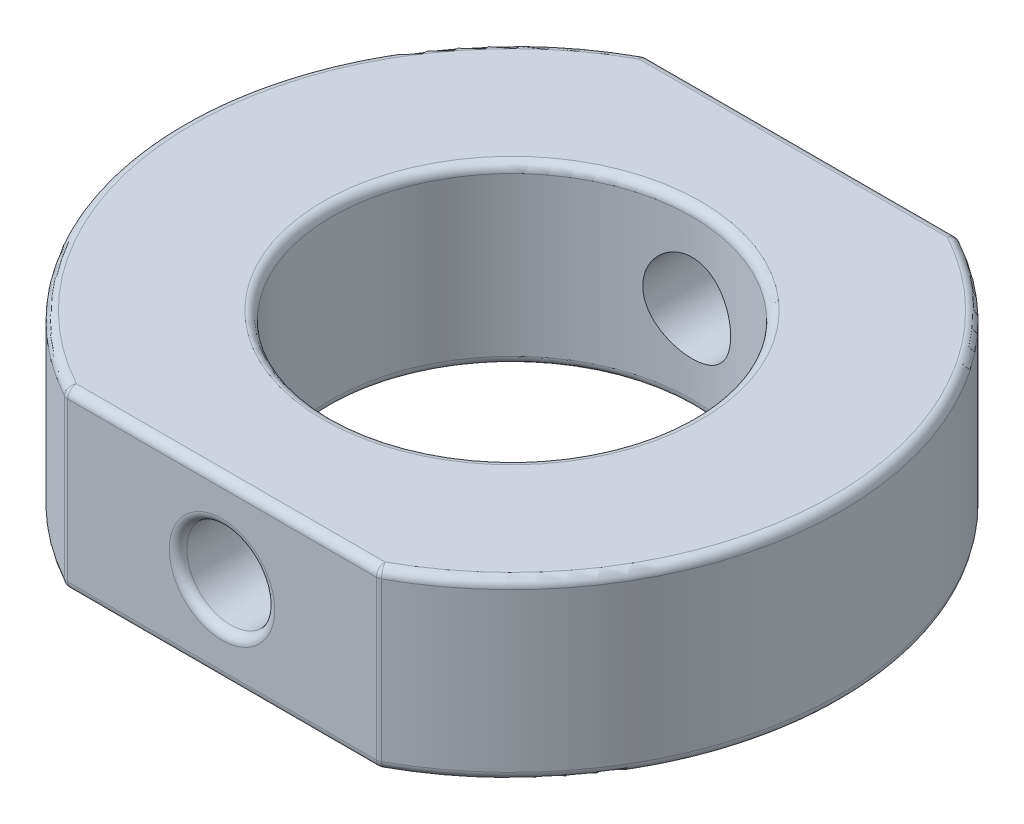
ISO-10303-21;
HEADER;
FILE_DESCRIPTION(('STEP AP214'),'2;1');
FILE_NAME('part.step','',(''),(''),'','','');
FILE_SCHEMA(('AUTOMOTIVE_DESIGN { 1 0 10303 214 1 1 1 1 }'));
ENDSEC;
DATA;
#1=APPLICATION_CONTEXT('core data for automotive mechanical design processes');
#2=APPLICATION_PROTOCOL_DEFINITION('international standard','automotive_design',2000,#1);
#3=PRODUCT_CONTEXT('',#1,'mechanical');
#4=PRODUCT('Part','Part','',(#3));
#5=PRODUCT_RELATED_PRODUCT_CATEGORY('part','',(#4));
#6=PRODUCT_DEFINITION_FORMATION('','',#4);
#7=PRODUCT_DEFINITION_CONTEXT('part definition',#1,'design');
#8=PRODUCT_DEFINITION('design','',#6,#7);
#9=PRODUCT_DEFINITION_SHAPE('','',#8);
#10=(LENGTH_UNIT() NAMED_UNIT(*) SI_UNIT(.MILLI.,.METRE.));
#11=(NAMED_UNIT(*) PLANE_ANGLE_UNIT() SI_UNIT($,.RADIAN.));
#12=(NAMED_UNIT(*) SI_UNIT($,.STERADIAN.) SOLID_ANGLE_UNIT());
#13=UNCERTAINTY_MEASURE_WITH_UNIT(LENGTH_MEASURE(1.E-05),#10,'distance_accuracy_value','');
#14=(GEOMETRIC_REPRESENTATION_CONTEXT(3) GLOBAL_UNCERTAINTY_ASSIGNED_CONTEXT((#13)) GLOBAL_UNIT_ASSIGNED_CONTEXT((#10,
#11,#12)) REPRESENTATION_CONTEXT('',''));
#15=CARTESIAN_POINT('',(0.,0.,0.));
#16=DIRECTION('',(0.,0.,1.));
#17=DIRECTION('',(1.,0.,0.));
#18=AXIS2_PLACEMENT_3D('',#15,#16,#17);
#19=CARTESIAN_POINT('',(0.,-2.,0.));
#20=DIRECTION('',(0.,1.,0.));
#21=DIRECTION('',(0.,0.,1.));
#22=AXIS2_PLACEMENT_3D('',#19,#20,#21);
#23=CYLINDRICAL_SURFACE('',#22,7.5);
#24=DIRECTION('',(0.,1.,0.));
#25=VECTOR('',#24,1.);
#26=CARTESIAN_POINT('',(3.6076129861807,-2.,-6.57534246575343));
#27=LINE('',#26,#25);
#28=CARTESIAN_POINT('',(3.6076129861807,-1.8,-6.57534246575343));
#29=VERTEX_POINT('',#28);
#30=CARTESIAN_POINT('',(3.6076129861807,1.8,-6.57534246575343));
#31=VERTEX_POINT('',#30);
#32=EDGE_CURVE('E189',#29,#31,#27,.T.);
#33=ORIENTED_EDGE('',*,*,#32,.T.);
#34=CARTESIAN_POINT('',(0.,1.8,0.));
#35=DIRECTION('',(0.,1.,0.));
#36=DIRECTION('',(0.,0.,1.));
#37=AXIS2_PLACEMENT_3D('',#34,#35,#36);
#38=CIRCLE('',#37,7.5);
#39=CARTESIAN_POINT('',(3.6076129861807,1.8,6.57534246575343));
#40=VERTEX_POINT('',#39);
#41=EDGE_CURVE('E196',#31,#40,#38,.F.);
#42=ORIENTED_EDGE('',*,*,#41,.T.);
#43=DIRECTION('',(0.,1.,0.));
#44=VECTOR('',#43,1.);
#45=CARTESIAN_POINT('',(3.6076129861807,-2.,6.57534246575343));
#46=LINE('',#45,#44);
#47=CARTESIAN_POINT('',(3.6076129861807,-1.8,6.57534246575343));
#48=VERTEX_POINT('',#47);
#49=EDGE_CURVE('E192',#40,#48,#46,.F.);
#50=ORIENTED_EDGE('',*,*,#49,.T.);
#51=CARTESIAN_POINT('',(0.,-1.8,0.));
#52=DIRECTION('',(0.,1.,0.));
#53=DIRECTION('',(0.,0.,1.));
#54=AXIS2_PLACEMENT_3D('',#51,#52,#53);
#55=CIRCLE('',#54,7.5);
#56=EDGE_CURVE('E186',#48,#29,#55,.T.);
#57=ORIENTED_EDGE('',*,*,#56,.T.);
#58=EDGE_LOOP('',(#33,#42,#50,#57));
#59=FACE_BOUND('',#58,.T.);
#60=ADVANCED_FACE('F39',(#59),#23,.T.);
#61=DIRECTION('',(0.,1.,0.));
#62=VECTOR('',#61,1.);
#63=CARTESIAN_POINT('',(-3.60761298618069,-2.,6.57534246575343));
#64=LINE('',#63,#62);
#65=CARTESIAN_POINT('',(-3.60761298618069,-1.8,6.57534246575343));
#66=VERTEX_POINT('',#65);
#67=CARTESIAN_POINT('',(-3.60761298618069,1.8,6.57534246575343));
#68=VERTEX_POINT('',#67);
#69=EDGE_CURVE('E149',#66,#68,#64,.T.);
#70=ORIENTED_EDGE('',*,*,#69,.T.);
#71=CARTESIAN_POINT('',(0.,1.8,0.));
#72=DIRECTION('',(0.,1.,0.));
#73=DIRECTION('',(0.,0.,1.));
#74=AXIS2_PLACEMENT_3D('',#71,#72,#73);
#75=CIRCLE('',#74,7.5);
#76=CARTESIAN_POINT('',(-3.6076129861807,1.8,-6.57534246575343));
#77=VERTEX_POINT('',#76);
#78=EDGE_CURVE('E207',#68,#77,#75,.F.);
#79=ORIENTED_EDGE('',*,*,#78,.T.);
#80=DIRECTION('',(0.,1.,0.));
#81=VECTOR('',#80,1.);
#82=CARTESIAN_POINT('',(-3.6076129861807,-2.,-6.57534246575343));
#83=LINE('',#82,#81);
#84=CARTESIAN_POINT('',(-3.6076129861807,-1.8,-6.57534246575343));
#85=VERTEX_POINT('',#84);
#86=EDGE_CURVE('E202',#77,#85,#83,.F.);
#87=ORIENTED_EDGE('',*,*,#86,.T.);
#88=CARTESIAN_POINT('',(0.,-1.8,0.));
#89=DIRECTION('',(0.,1.,0.));
#90=DIRECTION('',(0.,0.,1.));
#91=AXIS2_PLACEMENT_3D('',#88,#89,#90);
#92=CIRCLE('',#91,7.5);
#93=EDGE_CURVE('E199',#85,#66,#92,.T.);
#94=ORIENTED_EDGE('',*,*,#93,.T.);
#95=EDGE_LOOP('',(#70,#79,#87,#94));
#96=FACE_BOUND('',#95,.T.);
#97=ADVANCED_FACE('F387',(#96),#23,.T.);
#98=CARTESIAN_POINT('',(0.,-2.,0.));
#99=DIRECTION('',(0.,1.,0.));
#100=DIRECTION('',(0.,0.,1.));
#101=AXIS2_PLACEMENT_3D('',#98,#99,#100);
#102=PLANE('',#101);
#103=CARTESIAN_POINT('',(0.,-2.,0.));
#104=DIRECTION('',(0.,1.,0.));
#105=DIRECTION('',(0.,0.,1.));
#106=AXIS2_PLACEMENT_3D('',#103,#104,#105);
#107=CIRCLE('',#106,7.3);
#108=CARTESIAN_POINT('',(3.51140997321588,-2.,-6.4));
#109=VERTEX_POINT('',#108);
#110=CARTESIAN_POINT('',(3.51140997321588,-2.,6.40000000000001));
#111=VERTEX_POINT('',#110);
#112=EDGE_CURVE('E49',#109,#111,#107,.F.);
#113=ORIENTED_EDGE('',*,*,#112,.T.);
#114=DIRECTION('',(-1.,0.,0.));
#115=VECTOR('',#114,1.);
#116=CARTESIAN_POINT('',(0.,-2.,6.40000000000001));
#117=LINE('',#116,#115);
#118=CARTESIAN_POINT('',(-3.51140997321588,-2.,6.40000000000001));
#119=VERTEX_POINT('',#118);
#120=EDGE_CURVE('E11',#111,#119,#117,.T.);
#121=ORIENTED_EDGE('',*,*,#120,.T.);
#122=CARTESIAN_POINT('',(0.,-2.,0.));
#123=DIRECTION('',(0.,1.,0.));
#124=DIRECTION('',(0.,0.,1.));
#125=AXIS2_PLACEMENT_3D('',#122,#123,#124);
#126=CIRCLE('',#125,7.3);
#127=CARTESIAN_POINT('',(-3.51140997321589,-2.,-6.4));
#128=VERTEX_POINT('',#127);
#129=EDGE_CURVE('E260',#119,#128,#126,.F.);
#130=ORIENTED_EDGE('',*,*,#129,.T.);
#131=DIRECTION('',(1.,0.,0.));
#132=VECTOR('',#131,1.);
#133=CARTESIAN_POINT('',(0.,-2.,-6.4));
#134=LINE('',#133,#132);
#135=EDGE_CURVE('E60',#128,#109,#134,.T.);
#136=ORIENTED_EDGE('',*,*,#135,.T.);
#137=EDGE_LOOP('',(#113,#121,#130,#136));
#138=FACE_BOUND('',#137,.T.);
#139=CARTESIAN_POINT('',(0.,-2.,0.));
#140=DIRECTION('',(0.,1.,0.));
#141=DIRECTION('',(0.,0.,1.));
#142=AXIS2_PLACEMENT_3D('',#139,#140,#141);
#143=CIRCLE('',#142,4.3);
#144=CARTESIAN_POINT('',(0.,-2.,4.3));
#145=VERTEX_POINT('',#144);
#146=EDGE_CURVE('E256',#145,#145,#143,.T.);
#147=ORIENTED_EDGE('',*,*,#146,.T.);
#148=EDGE_LOOP('',(#147));
#149=FACE_BOUND('',#148,.T.);
#150=ADVANCED_FACE('F383',(#138,#149),#102,.F.);
#151=CARTESIAN_POINT('',(0.,-2.,0.));
#152=DIRECTION('',(0.,1.,0.));
#153=DIRECTION('',(0.,0.,1.));
#154=AXIS2_PLACEMENT_3D('',#151,#152,#153);
#155=CYLINDRICAL_SURFACE('',#154,4.1);
#156=CARTESIAN_POINT('',(0.,1.8,0.));
#157=DIRECTION('',(0.,1.,0.));
#158=DIRECTION('',(0.,0.,1.));
#159=AXIS2_PLACEMENT_3D('',#156,#157,#158);
#160=CIRCLE('',#159,4.1);
#161=CARTESIAN_POINT('',(0.,1.8,4.1));
#162=VERTEX_POINT('',#161);
#163=EDGE_CURVE('E235',#162,#162,#160,.T.);
#164=ORIENTED_EDGE('',*,*,#163,.T.);
#165=EDGE_LOOP('',(#164));
#166=FACE_BOUND('',#165,.T.);
#167=CARTESIAN_POINT('',(0.,-1.8,0.));
#168=DIRECTION('',(0.,1.,0.));
#169=DIRECTION('',(0.,0.,1.));
#170=AXIS2_PLACEMENT_3D('',#167,#168,#169);
#171=CIRCLE('',#170,4.1);
#172=CARTESIAN_POINT('',(0.,-1.8,4.1));
#173=VERTEX_POINT('',#172);
#174=EDGE_CURVE('E231',#173,#173,#171,.F.);
#175=ORIENTED_EDGE('',*,*,#174,.T.);
#176=EDGE_LOOP('',(#175));
#177=FACE_BOUND('',#176,.T.);
#178=CARTESIAN_POINT('',(0.,-1.,4.1));
#179=CARTESIAN_POINT('',(0.0552940782059804,-0.999998372036422,4.09999903855374));
#180=CARTESIAN_POINT('',(0.110606625106424,-0.995398405194165,4.09887023541631));
#181=CARTESIAN_POINT('',(0.219649336489441,-0.977145891798735,4.09447651710224));
#182=CARTESIAN_POINT('',(0.27337853637448,-0.963487941389928,4.09121032680828));
#183=CARTESIAN_POINT('',(0.377663887569064,-0.927581535553456,4.08290392259872));
#184=CARTESIAN_POINT('',(0.428223669187377,-0.905343125357365,4.07786578372922));
#185=CARTESIAN_POINT('',(0.524894583583664,-0.852941719679801,4.06655350781751));
#186=CARTESIAN_POINT('',(0.571005619145269,-0.822778551075884,4.06027934377413));
#187=CARTESIAN_POINT('',(0.658377598944572,-0.754756816530616,4.04703942321076));
#188=CARTESIAN_POINT('',(0.699538541166774,-0.716771789270321,4.04006341221194));
#189=CARTESIAN_POINT('',(0.774973181112786,-0.63445549766485,4.02627498773599));
#190=CARTESIAN_POINT('',(0.809246137026267,-0.590123550659623,4.01946259194909));
#191=CARTESIAN_POINT('',(0.870396245048834,-0.495602963098285,4.00666983608114));
#192=CARTESIAN_POINT('',(0.897162640440335,-0.445340743051743,4.00070252069429));
#193=CARTESIAN_POINT('',(0.941827948134004,-0.340861276481323,3.99042466007413));
#194=CARTESIAN_POINT('',(0.959728203354091,-0.286644630346247,3.98611386395683));
#195=CARTESIAN_POINT('',(0.985814126040096,-0.176892029513995,3.97974233878165));
#196=CARTESIAN_POINT('',(0.994179053402999,-0.121401143079764,3.97764015030589));
#197=CARTESIAN_POINT('',(1.00151504689488,-0.00976691073506362,3.9757996761513));
#198=CARTESIAN_POINT('',(1.00048756330193,0.0463763331081408,3.97606102551957));
#199=CARTESIAN_POINT('',(0.989211176077876,0.156356327065886,3.97888077440598));
#200=CARTESIAN_POINT('',(0.979174756911182,0.210216431265045,3.98138624131811));
#201=CARTESIAN_POINT('',(0.950503878980593,0.31546442464363,3.98832770386222));
#202=CARTESIAN_POINT('',(0.931868834068214,0.366852145022605,3.99276383110169));
#203=CARTESIAN_POINT('',(0.886345775444828,0.466272046962422,4.00311608473029));
#204=CARTESIAN_POINT('',(0.85937971496844,0.514266984566723,4.0090461049084));
#205=CARTESIAN_POINT('',(0.798014731838712,0.605127337396589,4.02171000195212));
#206=CARTESIAN_POINT('',(0.763614566500254,0.647991893163753,4.02844401312855));
#207=CARTESIAN_POINT('',(0.687252265162581,0.728593595599813,4.04218089019983));
#208=CARTESIAN_POINT('',(0.645110526335512,0.766160391374175,4.04918609759026));
#209=CARTESIAN_POINT('',(0.555042132200762,0.833725103344055,4.06251123383387));
#210=CARTESIAN_POINT('',(0.507115316594515,0.863722809736633,4.06883114368894));
#211=CARTESIAN_POINT('',(0.40660140379862,0.915356104020702,4.08010263682613));
#212=CARTESIAN_POINT('',(0.354000137064089,0.936965121833657,4.08504985840865));
#213=CARTESIAN_POINT('',(0.245764416646924,0.970987309599903,4.09298673249365));
#214=CARTESIAN_POINT('',(0.190130516410389,0.983402151469438,4.09597674089437));
#215=CARTESIAN_POINT('',(0.0788661990384491,0.998425963174271,4.09961003794025));
#216=CARTESIAN_POINT('',(0.0232688934224516,1.00126705696586,4.1003088666938));
#217=CARTESIAN_POINT('',(-0.0876065244200136,0.997697842506915,4.09943873121107));
#218=CARTESIAN_POINT('',(-0.142884663502494,0.991288324376395,4.09786996065663));
#219=CARTESIAN_POINT('',(-0.250753662696433,0.969591438723519,4.09267638085782));
#220=CARTESIAN_POINT('',(-0.303371321524609,0.954429707430751,4.08908068451773));
#221=CARTESIAN_POINT('',(-0.405314368401503,0.915801452895595,4.08023780565242));
#222=CARTESIAN_POINT('',(-0.45463943294741,0.892334115036999,4.07499046113868));
#223=CARTESIAN_POINT('',(-0.549528168551345,0.837304082762159,4.06329241453009));
#224=CARTESIAN_POINT('',(-0.595013284338723,0.805610071183155,4.05682270468826));
#225=CARTESIAN_POINT('',(-0.680102017696988,0.735195226973056,4.04342920300753));
#226=CARTESIAN_POINT('',(-0.719704669886258,0.696473243280604,4.03650533690443));
#227=CARTESIAN_POINT('',(-0.79285308547962,0.612026148094777,4.02278556894238));
#228=CARTESIAN_POINT('',(-0.826236402696306,0.566159003427226,4.01599639733157));
#229=CARTESIAN_POINT('',(-0.884830746828476,0.46933566573817,4.00349543267167));
#230=CARTESIAN_POINT('',(-0.910042139214909,0.418379700436079,3.99778359144617));
#231=CARTESIAN_POINT('',(-0.951391477981672,0.313101681998428,3.98814558858549));
#232=CARTESIAN_POINT('',(-0.967583115890355,0.258801731686838,3.98420888747609));
#233=CARTESIAN_POINT('',(-0.990578792127384,0.148140454119125,3.97855457467218));
#234=CARTESIAN_POINT('',(-0.997384766355246,0.091779554419802,3.97683650536436));
#235=CARTESIAN_POINT('',(-1.0013184796955,-0.0197540026068407,3.97584765644602));
#236=CARTESIAN_POINT('',(-0.998705390006952,-0.0749170880916083,3.97651133925525));
#237=CARTESIAN_POINT('',(-0.984465490009799,-0.183990734619739,3.98006036411582));
#238=CARTESIAN_POINT('',(-0.972838844248606,-0.237901318509702,3.98294566561028));
#239=CARTESIAN_POINT('',(-0.941040223166038,-0.342673391314973,3.99057720406715));
#240=CARTESIAN_POINT('',(-0.920914638060117,-0.393549746675563,3.99531332826666));
#241=CARTESIAN_POINT('',(-0.872726542508613,-0.491239107022708,4.00611475162218));
#242=CARTESIAN_POINT('',(-0.844662984569503,-0.53805157467314,4.01218022617524));
#243=CARTESIAN_POINT('',(-0.780573458182831,-0.627541979151474,4.02514563534908));
#244=CARTESIAN_POINT('',(-0.744366637789082,-0.670087954165547,4.03206258636593));
#245=CARTESIAN_POINT('',(-0.665373744427921,-0.748584684244539,4.04584754270277));
#246=CARTESIAN_POINT('',(-0.622586122222779,-0.784533881928943,4.05271553609786));
#247=CARTESIAN_POINT('',(-0.530767939394041,-0.849410824998653,4.06576800041917));
#248=CARTESIAN_POINT('',(-0.481643574995764,-0.87820874845831,4.07193885905787));
#249=CARTESIAN_POINT('',(-0.379105999715491,-0.927091829209374,4.0827597978445));
#250=CARTESIAN_POINT('',(-0.32569600689174,-0.94718345278728,4.08741100602347));
#251=CARTESIAN_POINT('',(-0.226956955234012,-0.974976635536325,4.09395131283817));
#252=CARTESIAN_POINT('',(-0.182112573955288,-0.984340621200724,4.09620431244597));
#253=CARTESIAN_POINT('',(-0.091516304294484,-0.996852765884684,4.09922900355809));
#254=CARTESIAN_POINT('',(-0.045764477809185,-1.00000134739389,4.1000007957468));
#255=CARTESIAN_POINT('',(0.,-1.,4.1));
#256=B_SPLINE_CURVE_WITH_KNOTS('',3,(#178,#179,#180,#181,#182,#183,#184,#185,#186,#187,#188,
#189,#190,#191,#192,#193,#194,#195,#196,#197,#198,#199,#200,#201,#202,#203,#204,#205,#206,#207,
#208,#209,#210,#211,#212,#213,#214,#215,#216,#217,#218,#219,#220,#221,#222,#223,#224,#225,#226,
#227,#228,#229,#230,#231,#232,#233,#234,#235,#236,#237,#238,#239,#240,#241,#242,#243,#244,#245,
#246,#247,#248,#249,#250,#251,#252,#253,#254,#255),.UNSPECIFIED.,.T.,.F.,(4,2,2,2,2,2,2,2,2,2,2,
2,2,2,2,2,2,2,2,2,2,2,2,2,2,2,2,2,2,2,2,2,2,2,2,2,2,2,4),(0.,0.165714565475039,
0.331528082786146,0.497148066653482,0.662771668917651,0.83131937859123,0.999885230506267,
1.17082104802173,1.34173096666584,1.50937193587935,1.67698702016157,1.84074970149463,
2.00452354780151,2.16988073651506,2.33526558774977,2.50513054703799,2.67500021419158,
2.84540361501654,3.01577602119679,3.18198667417589,3.34818313148946,3.51205118563363,
3.67593531645828,3.84261621817483,4.0093244440412,4.17991319063399,4.35049430697597,
4.52004885460143,4.68956842444614,4.85445960356811,5.01934777258209,5.18334732537854,
5.34736852963206,5.51547355233973,5.68361821070556,5.85462271352469,6.02549999039103,
6.16266397542853,6.29981863647723),.UNSPECIFIED.);
#257=CARTESIAN_POINT('',(0.,-1.,4.1));
#258=VERTEX_POINT('',#257);
#259=EDGE_CURVE('E174',#258,#258,#256,.T.);
#260=ORIENTED_EDGE('',*,*,#259,.T.);
#261=EDGE_LOOP('',(#260));
#262=FACE_BOUND('',#261,.T.);
#263=CARTESIAN_POINT('',(1.,0.,-3.97617907041421));
#264=CARTESIAN_POINT('',(0.999998354894556,-0.0552664947056086,-3.97618014879861));
#265=CARTESIAN_POINT('',(0.995402819275441,-0.110551495762608,-3.9773439046036));
#266=CARTESIAN_POINT('',(0.97716949948839,-0.219537054813343,-3.98186199002674));
#267=CARTESIAN_POINT('',(0.963526194550283,-0.27323662449891,-3.98521765708705));
#268=CARTESIAN_POINT('',(0.927662589266128,-0.377459148375652,-3.99371742164718));
#269=CARTESIAN_POINT('',(0.905453018061679,-0.427985984688974,-3.99885928116604));
#270=CARTESIAN_POINT('',(0.853119639276222,-0.524601128877261,-4.01034930702422));
#271=CARTESIAN_POINT('',(0.822995595789041,-0.570689304393376,-4.01669750931937));
#272=CARTESIAN_POINT('',(0.755014388473099,-0.658084699530326,-4.03003380163035));
#273=CARTESIAN_POINT('',(0.717021957019948,-0.69928522225761,-4.03703171013413));
#274=CARTESIAN_POINT('',(0.634673938958121,-0.774796934496279,-4.05079359739173));
#275=CARTESIAN_POINT('',(0.590317779703718,-0.809107503341535,-4.05755755502522));
#276=CARTESIAN_POINT('',(0.495773613257062,-0.870298943026043,-4.07019771834586));
#277=CARTESIAN_POINT('',(0.445516174323705,-0.897075441556638,-4.07606098595713));
#278=CARTESIAN_POINT('',(0.341046968906842,-0.941760718097219,-4.08612734950638));
#279=CARTESIAN_POINT('',(0.286835758152317,-0.959670739604226,-4.09033067822912));
#280=CARTESIAN_POINT('',(0.177109647901485,-0.985774163713439,-4.09653415817532));
#281=CARTESIAN_POINT('',(0.121640182908127,-0.994148638729828,-4.09857531318709));
#282=CARTESIAN_POINT('',(0.0100486248078799,-1.00151116649254,-4.10036718316312));
#283=CARTESIAN_POINT('',(-0.0460733751637114,-1.00050054272564,-4.10011822107978));
#284=CARTESIAN_POINT('',(-0.156122626762065,-0.989252741682318,-4.09738859841481));
#285=CARTESIAN_POINT('',(-0.210071196583999,-0.979210954923416,-4.09495520047772));
#286=CARTESIAN_POINT('',(-0.315493255760603,-0.950499387716224,-4.08818490628843));
#287=CARTESIAN_POINT('',(-0.366966616867386,-0.931829160733567,-4.08384791152289));
#288=CARTESIAN_POINT('',(-0.466497522307262,-0.886229628560784,-4.07368466644016));
#289=CARTESIAN_POINT('',(-0.514521445961785,-0.85922986955892,-4.06784578555376));
#290=CARTESIAN_POINT('',(-0.605425887774648,-0.797790942022506,-4.05531357341858));
#291=CARTESIAN_POINT('',(-0.648305548068038,-0.763350535349225,-4.0486201000398));
#292=CARTESIAN_POINT('',(-0.728869031335191,-0.686957070298146,-4.03490582583808));
#293=CARTESIAN_POINT('',(-0.766390364323439,-0.644833191748799,-4.02788103515603));
#294=CARTESIAN_POINT('',(-0.833871513768246,-0.554817558065296,-4.01445456607548));
#295=CARTESIAN_POINT('',(-0.863831010846251,-0.50692555943737,-4.00805291400261));
#296=CARTESIAN_POINT('',(-0.915435388425165,-0.406426035173162,-3.9965839374696));
#297=CARTESIAN_POINT('',(-0.937042894194617,-0.35379858312229,-3.99152264209724));
#298=CARTESIAN_POINT('',(-0.971054294686876,-0.245505278362357,-3.98338582920665));
#299=CARTESIAN_POINT('',(-0.983460051844545,-0.189840042950941,-3.98030990986447));
#300=CARTESIAN_POINT('',(-0.99844984390046,-0.0785536957002052,-3.9765759870708));
#301=CARTESIAN_POINT('',(-1.00127338019803,-0.0229667832203306,-3.97585903692943));
#302=CARTESIAN_POINT('',(-0.997672785628168,0.0878838550798548,-3.97676406742503));
#303=CARTESIAN_POINT('',(-0.991249460667079,0.143147608643477,-3.97838584423124));
#304=CARTESIAN_POINT('',(-0.969547048686514,0.250905364034986,-3.98372927416764));
#305=CARTESIAN_POINT('',(-0.954405842602318,0.303428911192703,-3.98741820960549));
#306=CARTESIAN_POINT('',(-0.91584960266272,0.405192687164021,-3.99644956063349));
#307=CARTESIAN_POINT('',(-0.89243362551639,0.45443254088862,-4.00179216472665));
#308=CARTESIAN_POINT('',(-0.837485896742051,0.549250421969738,-4.01365408669239));
#309=CARTESIAN_POINT('',(-0.805810062249056,0.594742369368468,-4.0201936091507));
#310=CARTESIAN_POINT('',(-0.735425242868792,0.67985314864334,-4.03366222107891));
#311=CARTESIAN_POINT('',(-0.696715160350508,0.71947106217496,-4.04059137123));
#312=CARTESIAN_POINT('',(-0.6122646220615,0.792670996063341,-4.05425716120786));
#313=CARTESIAN_POINT('',(-0.56637935777137,0.826087816722927,-4.06098535334818));
#314=CARTESIAN_POINT('',(-0.469509033336577,0.884741000323581,-4.07332071676345));
#315=CARTESIAN_POINT('',(-0.418524235529817,0.909977783791528,-4.07892794566024));
#316=CARTESIAN_POINT('',(-0.313249736509444,0.951340842526493,-4.0883547748792));
#317=CARTESIAN_POINT('',(-0.258986472691204,0.967531403096379,-4.09218695504223));
#318=CARTESIAN_POINT('',(-0.148404057359916,0.990537277135948,-4.09768685091848));
#319=CARTESIAN_POINT('',(-0.0920852842078912,0.997354307161562,-4.09935496293001));
#320=CARTESIAN_POINT('',(0.0194543079715123,1.0013269645696,-4.1003234934313));
#321=CARTESIAN_POINT('',(0.0746660394258425,0.998726940867623,-4.09968379551291));
#322=CARTESIAN_POINT('',(0.18384053888434,0.984496281308648,-4.09624045676387));
#323=CARTESIAN_POINT('',(0.237803340768966,0.972865890720199,-4.09343687470522));
#324=CARTESIAN_POINT('',(0.342705952713755,0.94103301597448,-4.08598908315761));
#325=CARTESIAN_POINT('',(0.393659273851972,0.92087279365341,-4.08135395561204));
#326=CARTESIAN_POINT('',(0.491488592203527,0.872591244304514,-4.07073248017937));
#327=CARTESIAN_POINT('',(0.538364096782815,0.844468957134419,-4.06474596934716));
#328=CARTESIAN_POINT('',(0.627872837184352,0.780305789496895,-4.05189696828924));
#329=CARTESIAN_POINT('',(0.670383881741374,0.744097842492,-4.04501751412321));
#330=CARTESIAN_POINT('',(0.748809649955343,0.665118152263837,-4.03123716991484));
#331=CARTESIAN_POINT('',(0.784722718503422,0.622344767019454,-4.02433627493433));
#332=CARTESIAN_POINT('',(0.849549017079657,0.530545881445581,-4.01115725854116));
#333=CARTESIAN_POINT('',(0.878328521858665,0.481423936218635,-4.00489217311177));
#334=CARTESIAN_POINT('',(0.927177787795797,0.378894012024214,-3.99386691671324));
#335=CARTESIAN_POINT('',(0.947254103581312,0.325489294585901,-3.98910561393737));
#336=CARTESIAN_POINT('',(0.97501416690638,0.226787908430982,-3.98239961648338));
#337=CARTESIAN_POINT('',(0.984363955342679,0.181977719324704,-3.9800840245862));
#338=CARTESIAN_POINT('',(0.99685731481078,0.0914491973138945,-3.97697336362931));
#339=CARTESIAN_POINT('',(1.00000136126254,0.0457309342476907,-3.9761781780919));
#340=CARTESIAN_POINT('',(1.,0.,-3.97617907041421));
#341=B_SPLINE_CURVE_WITH_KNOTS('',3,(#263,#264,#265,#266,#267,#268,#269,#270,#271,#272,#273,
#274,#275,#276,#277,#278,#279,#280,#281,#282,#283,#284,#285,#286,#287,#288,#289,#290,#291,#292,
#293,#294,#295,#296,#297,#298,#299,#300,#301,#302,#303,#304,#305,#306,#307,#308,#309,#310,#311,
#312,#313,#314,#315,#316,#317,#318,#319,#320,#321,#322,#323,#324,#325,#326,#327,#328,#329,#330,
#331,#332,#333,#334,#335,#336,#337,#338,#339,#340),.UNSPECIFIED.,.T.,.F.,(4,2,2,2,2,2,2,2,2,2,2,
2,2,2,2,2,2,2,2,2,2,2,2,2,2,2,2,2,2,2,2,2,2,2,2,2,2,2,4),(0.,0.165631619025832,
0.331364396299708,0.496890265895607,0.662421069870449,0.831077199832946,0.999748515997974,
1.17065280870269,1.34153312579382,1.50911142024879,1.67666608316911,1.84068063742942,
2.0047036806328,2.17015399266376,2.33563185719362,2.50537670434157,2.67512871956306,
2.84563180687518,3.01610037492106,3.18227550486604,3.34843615276347,3.51203831496289,
3.67565913317633,3.84235110349347,4.00906910696103,4.17973613692796,4.35039439169506,
4.51982394763502,4.68922247214461,4.85425738505939,5.01928781571353,5.18350998993831,
5.34775197609145,5.51576695648127,5.68382402622071,5.85482676933539,6.02570050056586,
6.16276490216324,6.299818802892),.UNSPECIFIED.);
#342=CARTESIAN_POINT('',(1.,0.,-3.97617907041421));
#343=VERTEX_POINT('',#342);
#344=EDGE_CURVE('E343',#343,#343,#341,.T.);
#345=ORIENTED_EDGE('',*,*,#344,.T.);
#346=EDGE_LOOP('',(#345));
#347=FACE_BOUND('',#346,.T.);
#348=ADVANCED_FACE('F363',(#166,#177,#262,#347),#155,.F.);
#349=CARTESIAN_POINT('',(0.,2.,0.));
#350=DIRECTION('',(0.,1.,0.));
#351=DIRECTION('',(0.,0.,1.));
#352=AXIS2_PLACEMENT_3D('',#349,#350,#351);
#353=PLANE('',#352);
#354=CARTESIAN_POINT('',(0.,2.,0.));
#355=DIRECTION('',(0.,1.,0.));
#356=DIRECTION('',(0.,0.,1.));
#357=AXIS2_PLACEMENT_3D('',#354,#355,#356);
#358=CIRCLE('',#357,4.3);
#359=CARTESIAN_POINT('',(0.,2.,4.3));
#360=VERTEX_POINT('',#359);
#361=EDGE_CURVE('E252',#360,#360,#358,.F.);
#362=ORIENTED_EDGE('',*,*,#361,.T.);
#363=EDGE_LOOP('',(#362));
#364=FACE_BOUND('',#363,.T.);
#365=DIRECTION('',(-1.,0.,0.));
#366=VECTOR('',#365,1.);
#367=CARTESIAN_POINT('',(3.56230262611136,2.,6.4));
#368=LINE('',#367,#366);
#369=CARTESIAN_POINT('',(-3.51140997321588,2.,6.40000000000001));
#370=VERTEX_POINT('',#369);
#371=CARTESIAN_POINT('',(3.51140997321588,2.,6.4));
#372=VERTEX_POINT('',#371);
#373=EDGE_CURVE('E245',#370,#372,#368,.F.);
#374=ORIENTED_EDGE('',*,*,#373,.T.);
#375=CARTESIAN_POINT('',(0.,2.,0.));
#376=DIRECTION('',(0.,1.,0.));
#377=DIRECTION('',(0.,0.,1.));
#378=AXIS2_PLACEMENT_3D('',#375,#376,#377);
#379=CIRCLE('',#378,7.3);
#380=CARTESIAN_POINT('',(3.51140997321588,2.,-6.4));
#381=VERTEX_POINT('',#380);
#382=EDGE_CURVE('E248',#372,#381,#379,.T.);
#383=ORIENTED_EDGE('',*,*,#382,.T.);
#384=DIRECTION('',(1.,0.,0.));
#385=VECTOR('',#384,1.);
#386=CARTESIAN_POINT('',(-3.56230262611137,2.,-6.4));
#387=LINE('',#386,#385);
#388=CARTESIAN_POINT('',(-3.51140997321589,2.,-6.4));
#389=VERTEX_POINT('',#388);
#390=EDGE_CURVE('E239',#381,#389,#387,.F.);
#391=ORIENTED_EDGE('',*,*,#390,.T.);
#392=CARTESIAN_POINT('',(0.,2.,0.));
#393=DIRECTION('',(0.,1.,0.));
#394=DIRECTION('',(0.,0.,1.));
#395=AXIS2_PLACEMENT_3D('',#392,#393,#394);
#396=CIRCLE('',#395,7.3);
#397=EDGE_CURVE('E242',#389,#370,#396,.T.);
#398=ORIENTED_EDGE('',*,*,#397,.T.);
#399=EDGE_LOOP('',(#374,#383,#391,#398));
#400=FACE_BOUND('',#399,.T.);
#401=ADVANCED_FACE('F374',(#364,#400),#353,.T.);
#402=CARTESIAN_POINT('',(0.,0.,-7.5));
#403=DIRECTION('',(0.,0.,1.));
#404=DIRECTION('',(1.,0.,0.));
#405=AXIS2_PLACEMENT_3D('',#402,#403,#404);
#406=CYLINDRICAL_SURFACE('',#405,1.);
#407=CARTESIAN_POINT('',(0.,0.,-6.4));
#408=DIRECTION('',(0.,0.,1.));
#409=DIRECTION('',(1.,0.,0.));
#410=AXIS2_PLACEMENT_3D('',#407,#408,#409);
#411=CIRCLE('',#410,1.);
#412=CARTESIAN_POINT('',(1.,0.,-6.4));
#413=VERTEX_POINT('',#412);
#414=EDGE_CURVE('E210',#413,#413,#411,.F.);
#415=ORIENTED_EDGE('',*,*,#414,.T.);
#416=EDGE_LOOP('',(#415));
#417=FACE_BOUND('',#416,.T.);
#418=ORIENTED_EDGE('',*,*,#344,.F.);
#419=EDGE_LOOP('',(#418));
#420=FACE_BOUND('',#419,.T.);
#421=ADVANCED_FACE('F371',(#417,#420),#406,.F.);
#422=CARTESIAN_POINT('',(0.,0.,6.4));
#423=DIRECTION('',(0.,0.,-1.));
#424=DIRECTION('',(-1.,0.,0.));
#425=AXIS2_PLACEMENT_3D('',#422,#423,#424);
#426=CIRCLE('',#425,1.);
#427=CARTESIAN_POINT('',(-1.,0.,6.4));
#428=VERTEX_POINT('',#427);
#429=EDGE_CURVE('E170',#428,#428,#426,.F.);
#430=ORIENTED_EDGE('',*,*,#429,.T.);
#431=EDGE_LOOP('',(#430));
#432=FACE_BOUND('',#431,.T.);
#433=ORIENTED_EDGE('',*,*,#259,.F.);
#434=EDGE_LOOP('',(#433));
#435=FACE_BOUND('',#434,.T.);
#436=ADVANCED_FACE('F367',(#432,#435),#406,.F.);
#437=CARTESIAN_POINT('',(-12.8533613091427,-2.,6.60000000000001));
#438=DIRECTION('',(0.,0.,-1.));
#439=DIRECTION('',(-1.,0.,0.));
#440=AXIS2_PLACEMENT_3D('',#437,#438,#439);
#441=PLANE('',#440);
#442=CARTESIAN_POINT('',(0.,0.,6.6));
#443=DIRECTION('',(0.,0.,-1.));
#444=DIRECTION('',(-1.,0.,0.));
#445=AXIS2_PLACEMENT_3D('',#442,#443,#444);
#446=CIRCLE('',#445,1.2);
#447=CARTESIAN_POINT('',(-1.2,0.,6.6));
#448=VERTEX_POINT('',#447);
#449=EDGE_CURVE('E182',#448,#448,#446,.T.);
#450=ORIENTED_EDGE('',*,*,#449,.T.);
#451=EDGE_LOOP('',(#450));
#452=FACE_BOUND('',#451,.T.);
#453=DIRECTION('',(0.,-1.,0.));
#454=VECTOR('',#453,1.);
#455=CARTESIAN_POINT('',(3.51140997321588,2.,6.6));
#456=LINE('',#455,#454);
#457=CARTESIAN_POINT('',(3.51140997321588,-1.8,6.6));
#458=VERTEX_POINT('',#457);
#459=CARTESIAN_POINT('',(3.51140997321588,1.8,6.6));
#460=VERTEX_POINT('',#459);
#461=EDGE_CURVE('E141',#458,#460,#456,.F.);
#462=ORIENTED_EDGE('',*,*,#461,.T.);
#463=DIRECTION('',(-1.,0.,0.));
#464=VECTOR('',#463,1.);
#465=CARTESIAN_POINT('',(-3.56230262611137,1.8,6.60000000000001));
#466=LINE('',#465,#464);
#467=CARTESIAN_POINT('',(-3.51140997321588,1.8,6.60000000000001));
#468=VERTEX_POINT('',#467);
#469=EDGE_CURVE('E136',#460,#468,#466,.T.);
#470=ORIENTED_EDGE('',*,*,#469,.T.);
#471=DIRECTION('',(0.,-1.,0.));
#472=VECTOR('',#471,1.);
#473=CARTESIAN_POINT('',(-3.51140997321588,-2.,6.60000000000001));
#474=LINE('',#473,#472);
#475=CARTESIAN_POINT('',(-3.51140997321588,-1.8,6.60000000000001));
#476=VERTEX_POINT('',#475);
#477=EDGE_CURVE('E128',#468,#476,#474,.T.);
#478=ORIENTED_EDGE('',*,*,#477,.T.);
#479=DIRECTION('',(-1.,0.,0.));
#480=VECTOR('',#479,1.);
#481=CARTESIAN_POINT('',(-12.8533613091427,-1.8,6.60000000000001));
#482=LINE('',#481,#480);
#483=EDGE_CURVE('E133',#476,#458,#482,.F.);
#484=ORIENTED_EDGE('',*,*,#483,.T.);
#485=EDGE_LOOP('',(#462,#470,#478,#484));
#486=FACE_BOUND('',#485,.T.);
#487=ADVANCED_FACE('F131',(#452,#486),#441,.F.);
#488=CARTESIAN_POINT('',(-12.8533613091427,-2.,-6.6));
#489=DIRECTION('',(0.,0.,1.));
#490=DIRECTION('',(1.,0.,0.));
#491=AXIS2_PLACEMENT_3D('',#488,#489,#490);
#492=PLANE('',#491);
#493=CARTESIAN_POINT('',(0.,0.,-6.6));
#494=DIRECTION('',(0.,0.,1.));
#495=DIRECTION('',(1.,0.,0.));
#496=AXIS2_PLACEMENT_3D('',#493,#494,#495);
#497=CIRCLE('',#496,1.2);
#498=CARTESIAN_POINT('',(1.2,0.,-6.6));
#499=VERTEX_POINT('',#498);
#500=EDGE_CURVE('E227',#499,#499,#497,.T.);
#501=ORIENTED_EDGE('',*,*,#500,.T.);
#502=EDGE_LOOP('',(#501));
#503=FACE_BOUND('',#502,.T.);
#504=DIRECTION('',(0.,-1.,0.));
#505=VECTOR('',#504,1.);
#506=CARTESIAN_POINT('',(-3.51140997321588,2.,-6.6));
#507=LINE('',#506,#505);
#508=CARTESIAN_POINT('',(-3.51140997321588,-1.8,-6.6));
#509=VERTEX_POINT('',#508);
#510=CARTESIAN_POINT('',(-3.51140997321588,1.8,-6.6));
#511=VERTEX_POINT('',#510);
#512=EDGE_CURVE('E220',#509,#511,#507,.F.);
#513=ORIENTED_EDGE('',*,*,#512,.T.);
#514=DIRECTION('',(1.,0.,0.));
#515=VECTOR('',#514,1.);
#516=CARTESIAN_POINT('',(3.56230262611137,1.8,-6.6));
#517=LINE('',#516,#515);
#518=CARTESIAN_POINT('',(3.51140997321588,1.8,-6.6));
#519=VERTEX_POINT('',#518);
#520=EDGE_CURVE('E224',#511,#519,#517,.T.);
#521=ORIENTED_EDGE('',*,*,#520,.T.);
#522=DIRECTION('',(0.,-1.,0.));
#523=VECTOR('',#522,1.);
#524=CARTESIAN_POINT('',(3.51140997321588,-2.,-6.6));
#525=LINE('',#524,#523);
#526=CARTESIAN_POINT('',(3.51140997321588,-1.8,-6.6));
#527=VERTEX_POINT('',#526);
#528=EDGE_CURVE('E217',#519,#527,#525,.T.);
#529=ORIENTED_EDGE('',*,*,#528,.T.);
#530=DIRECTION('',(1.,0.,0.));
#531=VECTOR('',#530,1.);
#532=CARTESIAN_POINT('',(-12.8533613091427,-1.8,-6.6));
#533=LINE('',#532,#531);
#534=EDGE_CURVE('E214',#527,#509,#533,.F.);
#535=ORIENTED_EDGE('',*,*,#534,.T.);
#536=EDGE_LOOP('',(#513,#521,#529,#535));
#537=FACE_BOUND('',#536,.T.);
#538=ADVANCED_FACE('F399',(#503,#537),#492,.F.);
#539=CARTESIAN_POINT('',(0.,0.,6.4));
#540=DIRECTION('',(0.,0.,-1.));
#541=DIRECTION('',(-1.,0.,0.));
#542=AXIS2_PLACEMENT_3D('',#539,#540,#541);
#543=TOROIDAL_SURFACE('',#542,1.2,0.2);
#544=ORIENTED_EDGE('',*,*,#449,.F.);
#545=EDGE_LOOP('',(#544));
#546=FACE_BOUND('',#545,.T.);
#547=ORIENTED_EDGE('',*,*,#429,.F.);
#548=EDGE_LOOP('',(#547));
#549=FACE_BOUND('',#548,.T.);
#550=ADVANCED_FACE('F395',(#546,#549),#543,.T.);
#551=CARTESIAN_POINT('',(-3.51140997321588,-2.,-6.4));
#552=DIRECTION('',(0.,1.,0.));
#553=DIRECTION('',(0.,0.,1.));
#554=AXIS2_PLACEMENT_3D('',#551,#552,#553);
#555=CYLINDRICAL_SURFACE('',#554,0.2);
#556=CARTESIAN_POINT('',(-3.51140997321588,-1.8,-6.4));
#557=DIRECTION('',(0.,-1.,0.));
#558=DIRECTION('',(0.,0.,-1.));
#559=AXIS2_PLACEMENT_3D('',#556,#557,#558);
#560=CIRCLE('',#559,0.2);
#561=EDGE_CURVE('E43',#85,#509,#560,.T.);
#562=ORIENTED_EDGE('',*,*,#561,.F.);
#563=ORIENTED_EDGE('',*,*,#86,.F.);
#564=CARTESIAN_POINT('',(-3.51140997321588,1.8,-6.4));
#565=DIRECTION('',(0.,1.,0.));
#566=DIRECTION('',(0.,0.,1.));
#567=AXIS2_PLACEMENT_3D('',#564,#565,#566);
#568=CIRCLE('',#567,0.2);
#569=EDGE_CURVE('E334',#511,#77,#568,.T.);
#570=ORIENTED_EDGE('',*,*,#569,.F.);
#571=ORIENTED_EDGE('',*,*,#512,.F.);
#572=EDGE_LOOP('',(#562,#563,#570,#571));
#573=FACE_BOUND('',#572,.T.);
#574=ADVANCED_FACE('F398',(#573),#555,.T.);
#575=CARTESIAN_POINT('',(-3.51140997321589,-1.8,-6.4));
#576=DIRECTION('',(0.,-1.,0.));
#577=DIRECTION('',(0.,0.,-1.));
#578=AXIS2_PLACEMENT_3D('',#575,#576,#577);
#579=SPHERICAL_SURFACE('',#578,0.2);
#580=CARTESIAN_POINT('',(-3.51140997321589,-1.8,-6.4));
#581=DIRECTION('',(0.876712328767124,0.,-0.481015064824093));
#582=DIRECTION('',(-0.481015064824093,0.,-0.876712328767124));
#583=AXIS2_PLACEMENT_3D('',#580,#581,#582);
#584=CIRCLE('',#583,0.2);
#585=EDGE_CURVE('E327',#85,#128,#584,.F.);
#586=ORIENTED_EDGE('',*,*,#585,.F.);
#587=ORIENTED_EDGE('',*,*,#561,.T.);
#588=CARTESIAN_POINT('',(-3.51140997321588,-1.8,-6.4));
#589=DIRECTION('',(-1.,0.,0.));
#590=DIRECTION('',(0.,-1.,0.));
#591=AXIS2_PLACEMENT_3D('',#588,#589,#590);
#592=CIRCLE('',#591,0.2);
#593=EDGE_CURVE('E331',#128,#509,#592,.F.);
#594=ORIENTED_EDGE('',*,*,#593,.F.);
#595=EDGE_LOOP('',(#586,#587,#594));
#596=FACE_BOUND('',#595,.T.);
#597=ADVANCED_FACE('F467',(#596),#579,.T.);
#598=CARTESIAN_POINT('',(-3.51140997321589,1.8,-6.4));
#599=DIRECTION('',(0.,1.,0.));
#600=DIRECTION('',(0.,0.,1.));
#601=AXIS2_PLACEMENT_3D('',#598,#599,#600);
#602=SPHERICAL_SURFACE('',#601,0.2);
#603=CARTESIAN_POINT('',(-3.51140997321589,1.8,-6.4));
#604=DIRECTION('',(-1.,0.,0.));
#605=DIRECTION('',(0.,0.,1.));
#606=AXIS2_PLACEMENT_3D('',#603,#604,#605);
#607=CIRCLE('',#606,0.2);
#608=EDGE_CURVE('E319',#511,#389,#607,.F.);
#609=ORIENTED_EDGE('',*,*,#608,.F.);
#610=ORIENTED_EDGE('',*,*,#569,.T.);
#611=CARTESIAN_POINT('',(-3.51140997321588,1.8,-6.4));
#612=DIRECTION('',(0.876712328767123,0.,-0.481015064824094));
#613=DIRECTION('',(-0.481015064824094,0.,-0.876712328767123));
#614=AXIS2_PLACEMENT_3D('',#611,#612,#613);
#615=CIRCLE('',#614,0.2);
#616=EDGE_CURVE('E323',#389,#77,#615,.F.);
#617=ORIENTED_EDGE('',*,*,#616,.F.);
#618=EDGE_LOOP('',(#609,#610,#617));
#619=FACE_BOUND('',#618,.T.);
#620=ADVANCED_FACE('F463',(#619),#602,.T.);
#621=CARTESIAN_POINT('',(0.,-1.8,-6.4));
#622=DIRECTION('',(1.,0.,0.));
#623=DIRECTION('',(0.,0.,-1.));
#624=AXIS2_PLACEMENT_3D('',#621,#622,#623);
#625=CYLINDRICAL_SURFACE('',#624,0.2);
#626=ORIENTED_EDGE('',*,*,#593,.T.);
#627=ORIENTED_EDGE('',*,*,#534,.F.);
#628=CARTESIAN_POINT('',(3.51140997321588,-1.8,-6.4));
#629=DIRECTION('',(1.,0.,0.));
#630=DIRECTION('',(0.,0.,-1.));
#631=AXIS2_PLACEMENT_3D('',#628,#629,#630);
#632=CIRCLE('',#631,0.2);
#633=EDGE_CURVE('E311',#109,#527,#632,.T.);
#634=ORIENTED_EDGE('',*,*,#633,.F.);
#635=ORIENTED_EDGE('',*,*,#135,.F.);
#636=EDGE_LOOP('',(#626,#627,#634,#635));
#637=FACE_BOUND('',#636,.T.);
#638=ADVANCED_FACE('F459',(#637),#625,.T.);
#639=CARTESIAN_POINT('',(0.,-1.8,0.));
#640=DIRECTION('',(0.,1.,0.));
#641=DIRECTION('',(0.,0.,1.));
#642=AXIS2_PLACEMENT_3D('',#639,#640,#641);
#643=TOROIDAL_SURFACE('',#642,7.3,0.2);
#644=ORIENTED_EDGE('',*,*,#585,.T.);
#645=ORIENTED_EDGE('',*,*,#129,.F.);
#646=CARTESIAN_POINT('',(-3.51140997321588,-1.8,6.40000000000001));
#647=DIRECTION('',(0.876712328767124,0.,0.481015064824093));
#648=DIRECTION('',(0.481015064824093,0.,-0.876712328767124));
#649=AXIS2_PLACEMENT_3D('',#646,#647,#648);
#650=CIRCLE('',#649,0.2);
#651=EDGE_CURVE('E154',#66,#119,#650,.T.);
#652=ORIENTED_EDGE('',*,*,#651,.F.);
#653=ORIENTED_EDGE('',*,*,#93,.F.);
#654=EDGE_LOOP('',(#644,#645,#652,#653));
#655=FACE_BOUND('',#654,.T.);
#656=ADVANCED_FACE('F456',(#655),#643,.T.);
#657=CARTESIAN_POINT('',(-3.51140997321588,-2.,6.40000000000001));
#658=DIRECTION('',(0.,1.,0.));
#659=DIRECTION('',(0.,0.,1.));
#660=AXIS2_PLACEMENT_3D('',#657,#658,#659);
#661=CYLINDRICAL_SURFACE('',#660,0.2);
#662=CARTESIAN_POINT('',(-3.51140997321588,1.8,6.40000000000001));
#663=DIRECTION('',(0.,1.,0.));
#664=DIRECTION('',(0.,0.,1.));
#665=AXIS2_PLACEMENT_3D('',#662,#663,#664);
#666=CIRCLE('',#665,0.2);
#667=EDGE_CURVE('E155',#68,#468,#666,.T.);
#668=ORIENTED_EDGE('',*,*,#667,.F.);
#669=ORIENTED_EDGE('',*,*,#69,.F.);
#670=CARTESIAN_POINT('',(-3.51140997321588,-1.8,6.40000000000001));
#671=DIRECTION('',(0.,-1.,0.));
#672=DIRECTION('',(0.,0.,-1.));
#673=AXIS2_PLACEMENT_3D('',#670,#671,#672);
#674=CIRCLE('',#673,0.2);
#675=EDGE_CURVE('E145',#476,#66,#674,.T.);
#676=ORIENTED_EDGE('',*,*,#675,.F.);
#677=ORIENTED_EDGE('',*,*,#477,.F.);
#678=EDGE_LOOP('',(#668,#669,#676,#677));
#679=FACE_BOUND('',#678,.T.);
#680=ADVANCED_FACE('F147',(#679),#661,.T.);
#681=CARTESIAN_POINT('',(0.,1.8,0.));
#682=DIRECTION('',(0.,1.,0.));
#683=DIRECTION('',(0.,0.,1.));
#684=AXIS2_PLACEMENT_3D('',#681,#682,#683);
#685=TOROIDAL_SURFACE('',#684,7.3,0.2);
#686=ORIENTED_EDGE('',*,*,#616,.T.);
#687=ORIENTED_EDGE('',*,*,#78,.F.);
#688=CARTESIAN_POINT('',(-3.51140997321588,1.8,6.40000000000001));
#689=DIRECTION('',(0.876712328767129,0.,0.481015064824084));
#690=DIRECTION('',(0.481015064824084,0.,-0.876712328767129));
#691=AXIS2_PLACEMENT_3D('',#688,#689,#690);
#692=CIRCLE('',#691,0.2);
#693=EDGE_CURVE('E304',#370,#68,#692,.T.);
#694=ORIENTED_EDGE('',*,*,#693,.F.);
#695=ORIENTED_EDGE('',*,*,#397,.F.);
#696=EDGE_LOOP('',(#686,#687,#694,#695));
#697=FACE_BOUND('',#696,.T.);
#698=ADVANCED_FACE('F449',(#697),#685,.T.);
#699=CARTESIAN_POINT('',(-12.8533613091427,1.8,-6.4));
#700=DIRECTION('',(-1.,0.,0.));
#701=DIRECTION('',(0.,0.,1.));
#702=AXIS2_PLACEMENT_3D('',#699,#700,#701);
#703=CYLINDRICAL_SURFACE('',#702,0.2);
#704=ORIENTED_EDGE('',*,*,#608,.T.);
#705=ORIENTED_EDGE('',*,*,#390,.F.);
#706=CARTESIAN_POINT('',(3.51140997321588,1.8,-6.4));
#707=DIRECTION('',(1.,0.,0.));
#708=DIRECTION('',(0.,1.,0.));
#709=AXIS2_PLACEMENT_3D('',#706,#707,#708);
#710=CIRCLE('',#709,0.2);
#711=EDGE_CURVE('E300',#519,#381,#710,.T.);
#712=ORIENTED_EDGE('',*,*,#711,.F.);
#713=ORIENTED_EDGE('',*,*,#520,.F.);
#714=EDGE_LOOP('',(#704,#705,#712,#713));
#715=FACE_BOUND('',#714,.T.);
#716=ADVANCED_FACE('F445',(#715),#703,.T.);
#717=CARTESIAN_POINT('',(3.51140997321588,-2.,-6.4));
#718=DIRECTION('',(0.,1.,0.));
#719=DIRECTION('',(0.,0.,1.));
#720=AXIS2_PLACEMENT_3D('',#717,#718,#719);
#721=CYLINDRICAL_SURFACE('',#720,0.2);
#722=CARTESIAN_POINT('',(3.51140997321588,-1.8,-6.4));
#723=DIRECTION('',(0.,-1.,0.));
#724=DIRECTION('',(0.,0.,-1.));
#725=AXIS2_PLACEMENT_3D('',#722,#723,#724);
#726=CIRCLE('',#725,0.2);
#727=EDGE_CURVE('E315',#527,#29,#726,.T.);
#728=ORIENTED_EDGE('',*,*,#727,.F.);
#729=ORIENTED_EDGE('',*,*,#528,.F.);
#730=CARTESIAN_POINT('',(3.51140997321588,1.8,-6.4));
#731=DIRECTION('',(0.,1.,0.));
#732=DIRECTION('',(0.,0.,1.));
#733=AXIS2_PLACEMENT_3D('',#730,#731,#732);
#734=CIRCLE('',#733,0.2);
#735=EDGE_CURVE('E296',#31,#519,#734,.T.);
#736=ORIENTED_EDGE('',*,*,#735,.F.);
#737=ORIENTED_EDGE('',*,*,#32,.F.);
#738=EDGE_LOOP('',(#728,#729,#736,#737));
#739=FACE_BOUND('',#738,.T.);
#740=ADVANCED_FACE('F441',(#739),#721,.T.);
#741=CARTESIAN_POINT('',(3.51140997321588,-1.8,-6.4));
#742=DIRECTION('',(0.,-1.,0.));
#743=DIRECTION('',(1.,0.,0.));
#744=AXIS2_PLACEMENT_3D('',#741,#742,#743);
#745=SPHERICAL_SURFACE('',#744,0.2);
#746=ORIENTED_EDGE('',*,*,#633,.T.);
#747=ORIENTED_EDGE('',*,*,#727,.T.);
#748=CARTESIAN_POINT('',(3.51140997321588,-1.8,-6.4));
#749=DIRECTION('',(-0.876712328767123,0.,-0.481015064824094));
#750=DIRECTION('',(-0.481015064824094,0.,0.876712328767123));
#751=AXIS2_PLACEMENT_3D('',#748,#749,#750);
#752=CIRCLE('',#751,0.2);
#753=EDGE_CURVE('E162',#109,#29,#752,.F.);
#754=ORIENTED_EDGE('',*,*,#753,.F.);
#755=EDGE_LOOP('',(#746,#747,#754));
#756=FACE_BOUND('',#755,.T.);
#757=ADVANCED_FACE('F438',(#756),#745,.T.);
#758=CARTESIAN_POINT('',(-3.51140997321588,-1.8,6.40000000000001));
#759=DIRECTION('',(0.,-1.,0.));
#760=DIRECTION('',(1.,0.,0.));
#761=AXIS2_PLACEMENT_3D('',#758,#759,#760);
#762=SPHERICAL_SURFACE('',#761,0.2);
#763=ORIENTED_EDGE('',*,*,#675,.T.);
#764=ORIENTED_EDGE('',*,*,#651,.T.);
#765=CARTESIAN_POINT('',(-3.51140997321588,-1.8,6.40000000000001));
#766=DIRECTION('',(-1.,0.,0.));
#767=DIRECTION('',(0.,0.,1.));
#768=AXIS2_PLACEMENT_3D('',#765,#766,#767);
#769=CIRCLE('',#768,0.2);
#770=EDGE_CURVE('E157',#476,#119,#769,.F.);
#771=ORIENTED_EDGE('',*,*,#770,.F.);
#772=EDGE_LOOP('',(#763,#764,#771));
#773=FACE_BOUND('',#772,.T.);
#774=ADVANCED_FACE('F158',(#773),#762,.T.);
#775=CARTESIAN_POINT('',(-3.51140997321588,1.8,6.40000000000001));
#776=DIRECTION('',(0.,1.,0.));
#777=DIRECTION('',(-1.,0.,0.));
#778=AXIS2_PLACEMENT_3D('',#775,#776,#777);
#779=SPHERICAL_SURFACE('',#778,0.2);
#780=ORIENTED_EDGE('',*,*,#693,.T.);
#781=ORIENTED_EDGE('',*,*,#667,.T.);
#782=CARTESIAN_POINT('',(-3.51140997321588,1.8,6.40000000000001));
#783=DIRECTION('',(-1.,0.,0.));
#784=DIRECTION('',(0.,-1.,0.));
#785=AXIS2_PLACEMENT_3D('',#782,#783,#784);
#786=CIRCLE('',#785,0.2);
#787=EDGE_CURVE('E163',#370,#468,#786,.F.);
#788=ORIENTED_EDGE('',*,*,#787,.F.);
#789=EDGE_LOOP('',(#780,#781,#788));
#790=FACE_BOUND('',#789,.T.);
#791=ADVANCED_FACE('F431',(#790),#779,.T.);
#792=CARTESIAN_POINT('',(3.51140997321588,1.8,-6.4));
#793=DIRECTION('',(0.,1.,0.));
#794=DIRECTION('',(0.,0.,1.));
#795=AXIS2_PLACEMENT_3D('',#792,#793,#794);
#796=SPHERICAL_SURFACE('',#795,0.2);
#797=ORIENTED_EDGE('',*,*,#735,.T.);
#798=ORIENTED_EDGE('',*,*,#711,.T.);
#799=CARTESIAN_POINT('',(3.51140997321588,1.8,-6.4));
#800=DIRECTION('',(-0.876712328767127,0.,-0.481015064824088));
#801=DIRECTION('',(-0.481015064824088,0.,0.876712328767127));
#802=AXIS2_PLACEMENT_3D('',#799,#800,#801);
#803=CIRCLE('',#802,0.2);
#804=EDGE_CURVE('E287',#31,#381,#803,.F.);
#805=ORIENTED_EDGE('',*,*,#804,.F.);
#806=EDGE_LOOP('',(#797,#798,#805));
#807=FACE_BOUND('',#806,.T.);
#808=ADVANCED_FACE('F427',(#807),#796,.T.);
#809=CARTESIAN_POINT('',(0.,-1.8,0.));
#810=DIRECTION('',(0.,1.,0.));
#811=DIRECTION('',(0.,0.,1.));
#812=AXIS2_PLACEMENT_3D('',#809,#810,#811);
#813=TOROIDAL_SURFACE('',#812,7.3,0.2);
#814=ORIENTED_EDGE('',*,*,#753,.T.);
#815=ORIENTED_EDGE('',*,*,#56,.F.);
#816=CARTESIAN_POINT('',(3.51140997321588,-1.8,6.40000000000001));
#817=DIRECTION('',(-0.876712328767123,0.,0.481015064824094));
#818=DIRECTION('',(0.481015064824094,0.,0.876712328767123));
#819=AXIS2_PLACEMENT_3D('',#816,#817,#818);
#820=CIRCLE('',#819,0.2);
#821=EDGE_CURVE('E283',#111,#48,#820,.T.);
#822=ORIENTED_EDGE('',*,*,#821,.F.);
#823=ORIENTED_EDGE('',*,*,#112,.F.);
#824=EDGE_LOOP('',(#814,#815,#822,#823));
#825=FACE_BOUND('',#824,.T.);
#826=ADVANCED_FACE('F424',(#825),#813,.T.);
#827=CARTESIAN_POINT('',(0.,-1.8,6.40000000000001));
#828=DIRECTION('',(-1.,0.,0.));
#829=DIRECTION('',(0.,0.,1.));
#830=AXIS2_PLACEMENT_3D('',#827,#828,#829);
#831=CYLINDRICAL_SURFACE('',#830,0.2);
#832=ORIENTED_EDGE('',*,*,#770,.T.);
#833=ORIENTED_EDGE('',*,*,#120,.F.);
#834=CARTESIAN_POINT('',(3.51140997321588,-1.8,6.4));
#835=DIRECTION('',(1.,0.,0.));
#836=DIRECTION('',(0.,0.,-1.));
#837=AXIS2_PLACEMENT_3D('',#834,#835,#836);
#838=CIRCLE('',#837,0.2);
#839=EDGE_CURVE('E167',#458,#111,#838,.T.);
#840=ORIENTED_EDGE('',*,*,#839,.F.);
#841=ORIENTED_EDGE('',*,*,#483,.F.);
#842=EDGE_LOOP('',(#832,#833,#840,#841));
#843=FACE_BOUND('',#842,.T.);
#844=ADVANCED_FACE('F165',(#843),#831,.T.);
#845=CARTESIAN_POINT('',(-12.8533613091427,1.8,6.40000000000001));
#846=DIRECTION('',(1.,0.,0.));
#847=DIRECTION('',(0.,0.,-1.));
#848=AXIS2_PLACEMENT_3D('',#845,#846,#847);
#849=CYLINDRICAL_SURFACE('',#848,0.2);
#850=ORIENTED_EDGE('',*,*,#787,.T.);
#851=ORIENTED_EDGE('',*,*,#469,.F.);
#852=CARTESIAN_POINT('',(3.51140997321588,1.8,6.4));
#853=DIRECTION('',(1.,0.,0.));
#854=DIRECTION('',(0.,0.,-1.));
#855=AXIS2_PLACEMENT_3D('',#852,#853,#854);
#856=CIRCLE('',#855,0.2);
#857=EDGE_CURVE('E277',#372,#460,#856,.T.);
#858=ORIENTED_EDGE('',*,*,#857,.F.);
#859=ORIENTED_EDGE('',*,*,#373,.F.);
#860=EDGE_LOOP('',(#850,#851,#858,#859));
#861=FACE_BOUND('',#860,.T.);
#862=ADVANCED_FACE('F417',(#861),#849,.T.);
#863=CARTESIAN_POINT('',(0.,1.8,0.));
#864=DIRECTION('',(0.,1.,0.));
#865=DIRECTION('',(0.,0.,1.));
#866=AXIS2_PLACEMENT_3D('',#863,#864,#865);
#867=TOROIDAL_SURFACE('',#866,7.3,0.2);
#868=ORIENTED_EDGE('',*,*,#804,.T.);
#869=ORIENTED_EDGE('',*,*,#382,.F.);
#870=CARTESIAN_POINT('',(3.51140997321588,1.8,6.4));
#871=DIRECTION('',(-0.876712328767124,0.,0.481015064824093));
#872=DIRECTION('',(0.481015064824093,0.,0.876712328767124));
#873=AXIS2_PLACEMENT_3D('',#870,#871,#872);
#874=CIRCLE('',#873,0.2);
#875=EDGE_CURVE('E273',#40,#372,#874,.T.);
#876=ORIENTED_EDGE('',*,*,#875,.F.);
#877=ORIENTED_EDGE('',*,*,#41,.F.);
#878=EDGE_LOOP('',(#868,#869,#876,#877));
#879=FACE_BOUND('',#878,.T.);
#880=ADVANCED_FACE('F413',(#879),#867,.T.);
#881=CARTESIAN_POINT('',(3.51140997321588,-1.8,6.4));
#882=DIRECTION('',(0.,-1.,0.));
#883=DIRECTION('',(0.,0.,-1.));
#884=AXIS2_PLACEMENT_3D('',#881,#882,#883);
#885=SPHERICAL_SURFACE('',#884,0.2);
#886=ORIENTED_EDGE('',*,*,#839,.T.);
#887=ORIENTED_EDGE('',*,*,#821,.T.);
#888=CARTESIAN_POINT('',(3.51140997321588,-1.8,6.4));
#889=DIRECTION('',(0.,-1.,0.));
#890=DIRECTION('',(0.,0.,-1.));
#891=AXIS2_PLACEMENT_3D('',#888,#889,#890);
#892=CIRCLE('',#891,0.2);
#893=EDGE_CURVE('E270',#458,#48,#892,.F.);
#894=ORIENTED_EDGE('',*,*,#893,.F.);
#895=EDGE_LOOP('',(#886,#887,#894));
#896=FACE_BOUND('',#895,.T.);
#897=ADVANCED_FACE('F409',(#896),#885,.T.);
#898=CARTESIAN_POINT('',(3.51140997321588,1.8,6.4));
#899=DIRECTION('',(0.,1.,0.));
#900=DIRECTION('',(0.,0.,1.));
#901=AXIS2_PLACEMENT_3D('',#898,#899,#900);
#902=SPHERICAL_SURFACE('',#901,0.2);
#903=ORIENTED_EDGE('',*,*,#875,.T.);
#904=ORIENTED_EDGE('',*,*,#857,.T.);
#905=CARTESIAN_POINT('',(3.51140997321588,1.8,6.4));
#906=DIRECTION('',(0.,1.,0.));
#907=DIRECTION('',(0.,0.,1.));
#908=AXIS2_PLACEMENT_3D('',#905,#906,#907);
#909=CIRCLE('',#908,0.2);
#910=EDGE_CURVE('E267',#40,#460,#909,.F.);
#911=ORIENTED_EDGE('',*,*,#910,.F.);
#912=EDGE_LOOP('',(#903,#904,#911));
#913=FACE_BOUND('',#912,.T.);
#914=ADVANCED_FACE('F405',(#913),#902,.T.);
#915=CARTESIAN_POINT('',(3.51140997321588,-2.,6.4));
#916=DIRECTION('',(0.,1.,0.));
#917=DIRECTION('',(0.,0.,1.));
#918=AXIS2_PLACEMENT_3D('',#915,#916,#917);
#919=CYLINDRICAL_SURFACE('',#918,0.2);
#920=ORIENTED_EDGE('',*,*,#893,.T.);
#921=ORIENTED_EDGE('',*,*,#49,.F.);
#922=ORIENTED_EDGE('',*,*,#910,.T.);
#923=ORIENTED_EDGE('',*,*,#461,.F.);
#924=EDGE_LOOP('',(#920,#921,#922,#923));
#925=FACE_BOUND('',#924,.T.);
#926=ADVANCED_FACE('F401',(#925),#919,.T.);
#927=CARTESIAN_POINT('',(0.,0.,-6.4));
#928=DIRECTION('',(0.,0.,1.));
#929=DIRECTION('',(1.,0.,0.));
#930=AXIS2_PLACEMENT_3D('',#927,#928,#929);
#931=TOROIDAL_SURFACE('',#930,1.2,0.2);
#932=ORIENTED_EDGE('',*,*,#500,.F.);
#933=EDGE_LOOP('',(#932));
#934=FACE_BOUND('',#933,.T.);
#935=ORIENTED_EDGE('',*,*,#414,.F.);
#936=EDGE_LOOP('',(#935));
#937=FACE_BOUND('',#936,.T.);
#938=ADVANCED_FACE('F404',(#934,#937),#931,.T.);
#939=CARTESIAN_POINT('',(0.,1.8,0.));
#940=DIRECTION('',(0.,1.,0.));
#941=DIRECTION('',(0.,0.,1.));
#942=AXIS2_PLACEMENT_3D('',#939,#940,#941);
#943=TOROIDAL_SURFACE('',#942,4.3,0.2);
#944=ORIENTED_EDGE('',*,*,#361,.F.);
#945=EDGE_LOOP('',(#944));
#946=FACE_BOUND('',#945,.T.);
#947=ORIENTED_EDGE('',*,*,#163,.F.);
#948=EDGE_LOOP('',(#947));
#949=FACE_BOUND('',#948,.T.);
#950=ADVANCED_FACE('F474',(#946,#949),#943,.T.);
#951=CARTESIAN_POINT('',(0.,-1.8,0.));
#952=DIRECTION('',(0.,1.,0.));
#953=DIRECTION('',(0.,0.,1.));
#954=AXIS2_PLACEMENT_3D('',#951,#952,#953);
#955=TOROIDAL_SURFACE('',#954,4.3,0.2);
#956=ORIENTED_EDGE('',*,*,#174,.F.);
#957=EDGE_LOOP('',(#956));
#958=FACE_BOUND('',#957,.T.);
#959=ORIENTED_EDGE('',*,*,#146,.F.);
#960=EDGE_LOOP('',(#959));
#961=FACE_BOUND('',#960,.T.);
#962=ADVANCED_FACE('F41',(#958,#961),#955,.T.);
#963=CLOSED_SHELL('',(#60,#97,#150,#348,#401,#421,#436,#487,#538,#550,#574,#597,#620,#638,#656,
#680,#698,#716,#740,#757,#774,#791,#808,#826,#844,#862,#880,#897,#914,#926,#938,#950,#962));
#964=MANIFOLD_SOLID_BREP('B2',#963);
#965=ADVANCED_BREP_SHAPE_REPRESENTATION('',(#18,#964),#14);
#966=SHAPE_DEFINITION_REPRESENTATION(#9,#965);
ENDSEC;
END-ISO-10303-21;
